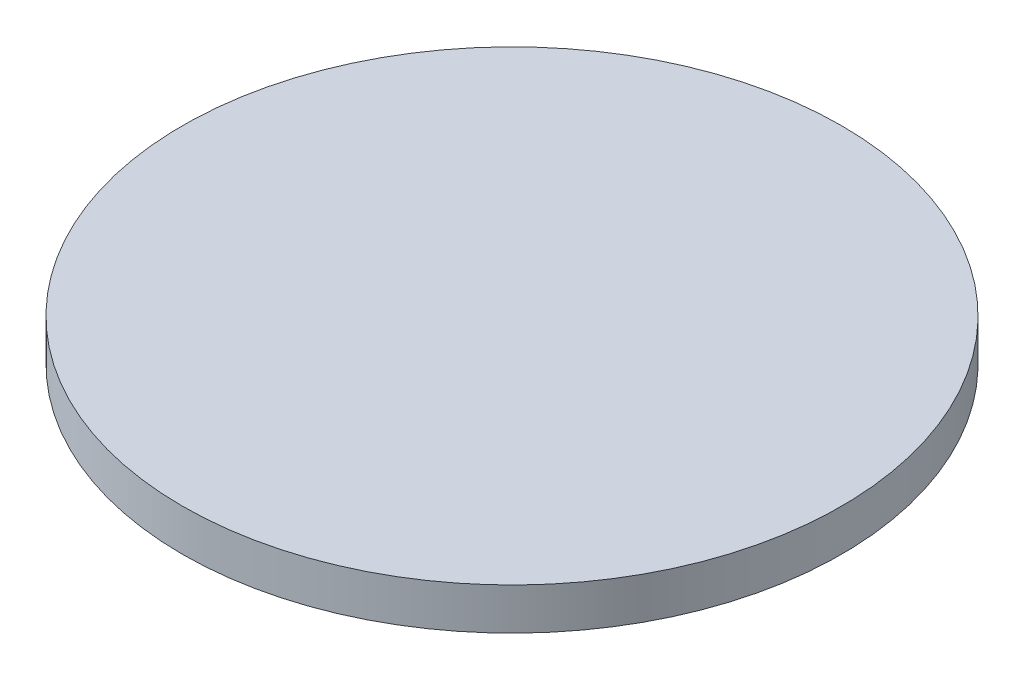
ISO-10303-21;
HEADER;
FILE_DESCRIPTION(('STEP AP214'),'2;1');
FILE_NAME('part.step','',(''),(''),'','','');
FILE_SCHEMA(('AUTOMOTIVE_DESIGN { 1 0 10303 214 1 1 1 1 }'));
ENDSEC;
DATA;
#1=APPLICATION_CONTEXT('core data for automotive mechanical design processes');
#2=APPLICATION_PROTOCOL_DEFINITION('international standard','automotive_design',2000,#1);
#3=PRODUCT_CONTEXT('',#1,'mechanical');
#4=PRODUCT('Part','Part','',(#3));
#5=PRODUCT_RELATED_PRODUCT_CATEGORY('part','',(#4));
#6=PRODUCT_DEFINITION_FORMATION('','',#4);
#7=PRODUCT_DEFINITION_CONTEXT('part definition',#1,'design');
#8=PRODUCT_DEFINITION('design','',#6,#7);
#9=PRODUCT_DEFINITION_SHAPE('','',#8);
#10=(LENGTH_UNIT() NAMED_UNIT(*) SI_UNIT(.MILLI.,.METRE.));
#11=(NAMED_UNIT(*) PLANE_ANGLE_UNIT() SI_UNIT($,.RADIAN.));
#12=(NAMED_UNIT(*) SI_UNIT($,.STERADIAN.) SOLID_ANGLE_UNIT());
#13=UNCERTAINTY_MEASURE_WITH_UNIT(LENGTH_MEASURE(1.E-05),#10,'distance_accuracy_value','');
#14=(GEOMETRIC_REPRESENTATION_CONTEXT(3) GLOBAL_UNCERTAINTY_ASSIGNED_CONTEXT((#13)) GLOBAL_UNIT_ASSIGNED_CONTEXT((#10,
#11,#12)) REPRESENTATION_CONTEXT('',''));
#15=CARTESIAN_POINT('',(0.,0.,0.));
#16=DIRECTION('',(0.,0.,1.));
#17=DIRECTION('',(1.,0.,0.));
#18=AXIS2_PLACEMENT_3D('',#15,#16,#17);
#19=CARTESIAN_POINT('',(0.,1.,0.));
#20=DIRECTION('',(0.,-1.,0.));
#21=DIRECTION('',(0.,0.,-1.));
#22=AXIS2_PLACEMENT_3D('',#19,#20,#21);
#23=CYLINDRICAL_SURFACE('',#22,7.9);
#24=CARTESIAN_POINT('',(0.,1.,0.));
#25=DIRECTION('',(0.,1.,0.));
#26=DIRECTION('',(0.,0.,1.));
#27=AXIS2_PLACEMENT_3D('',#24,#25,#26);
#28=CIRCLE('',#27,7.9);
#29=CARTESIAN_POINT('',(0.,1.,7.9));
#30=VERTEX_POINT('',#29);
#31=EDGE_CURVE('E10',#30,#30,#28,.T.);
#32=ORIENTED_EDGE('',*,*,#31,.F.);
#33=EDGE_LOOP('',(#32));
#34=FACE_BOUND('',#33,.T.);
#35=CARTESIAN_POINT('',(0.,0.,0.));
#36=DIRECTION('',(0.,1.,0.));
#37=DIRECTION('',(0.,0.,1.));
#38=AXIS2_PLACEMENT_3D('',#35,#36,#37);
#39=CIRCLE('',#38,7.9);
#40=CARTESIAN_POINT('',(0.,0.,7.9));
#41=VERTEX_POINT('',#40);
#42=EDGE_CURVE('E36',#41,#41,#39,.T.);
#43=ORIENTED_EDGE('',*,*,#42,.T.);
#44=EDGE_LOOP('',(#43));
#45=FACE_BOUND('',#44,.T.);
#46=ADVANCED_FACE('F33',(#34,#45),#23,.T.);
#47=CARTESIAN_POINT('',(0.,1.,0.));
#48=DIRECTION('',(0.,1.,0.));
#49=DIRECTION('',(0.,0.,1.));
#50=AXIS2_PLACEMENT_3D('',#47,#48,#49);
#51=PLANE('',#50);
#52=ORIENTED_EDGE('',*,*,#31,.T.);
#53=EDGE_LOOP('',(#52));
#54=FACE_BOUND('',#53,.T.);
#55=ADVANCED_FACE('F48',(#54),#51,.T.);
#56=CARTESIAN_POINT('',(0.,0.,0.));
#57=DIRECTION('',(0.,1.,0.));
#58=DIRECTION('',(0.,0.,1.));
#59=AXIS2_PLACEMENT_3D('',#56,#57,#58);
#60=PLANE('',#59);
#61=ORIENTED_EDGE('',*,*,#42,.F.);
#62=EDGE_LOOP('',(#61));
#63=FACE_BOUND('',#62,.T.);
#64=ADVANCED_FACE('F46',(#63),#60,.F.);
#65=CLOSED_SHELL('',(#46,#55,#64));
#66=MANIFOLD_SOLID_BREP('B2',#65);
#67=ADVANCED_BREP_SHAPE_REPRESENTATION('',(#18,#66),#14);
#68=SHAPE_DEFINITION_REPRESENTATION(#9,#67);
ENDSEC;
END-ISO-10303-21;
